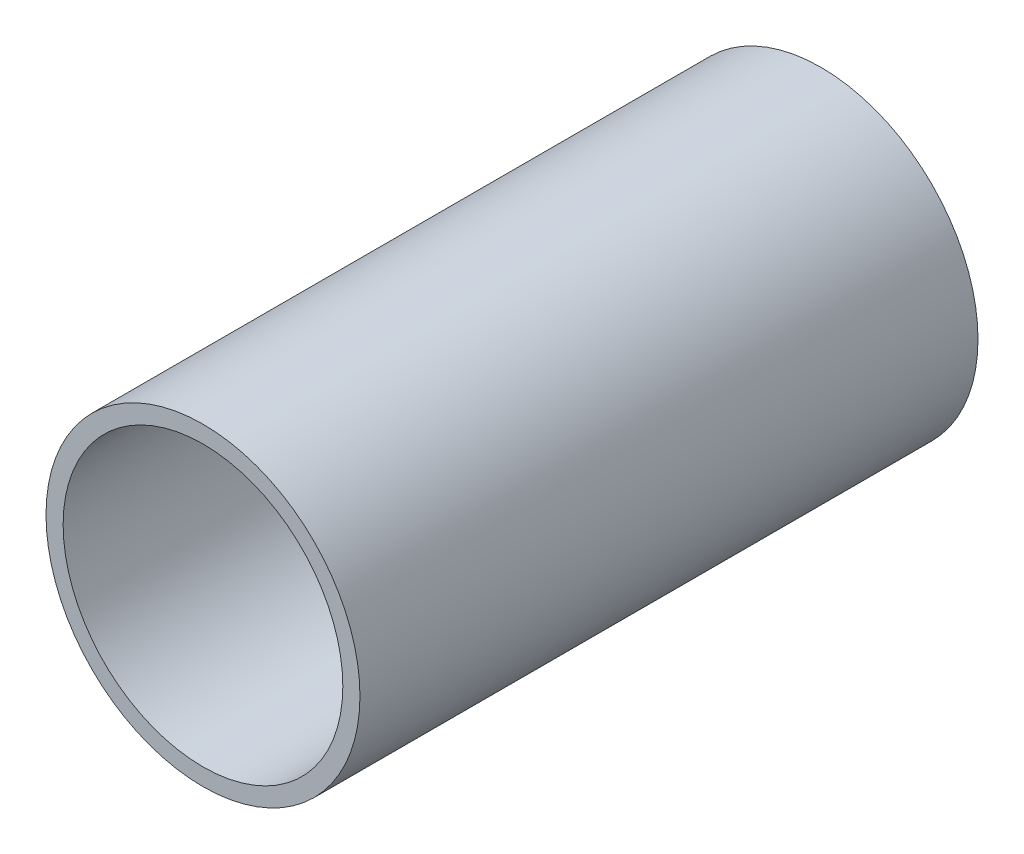
ISO-10303-21;
HEADER;
FILE_DESCRIPTION(('STEP AP214'),'2;1');
FILE_NAME('part.step','',(''),(''),'','','');
FILE_SCHEMA(('AUTOMOTIVE_DESIGN { 1 0 10303 214 1 1 1 1 }'));
ENDSEC;
DATA;
#1=APPLICATION_CONTEXT('core data for automotive mechanical design processes');
#2=APPLICATION_PROTOCOL_DEFINITION('international standard','automotive_design',2000,#1);
#3=PRODUCT_CONTEXT('',#1,'mechanical');
#4=PRODUCT('Part','Part','',(#3));
#5=PRODUCT_RELATED_PRODUCT_CATEGORY('part','',(#4));
#6=PRODUCT_DEFINITION_FORMATION('','',#4);
#7=PRODUCT_DEFINITION_CONTEXT('part definition',#1,'design');
#8=PRODUCT_DEFINITION('design','',#6,#7);
#9=PRODUCT_DEFINITION_SHAPE('','',#8);
#10=(LENGTH_UNIT() NAMED_UNIT(*) SI_UNIT(.MILLI.,.METRE.));
#11=(NAMED_UNIT(*) PLANE_ANGLE_UNIT() SI_UNIT($,.RADIAN.));
#12=(NAMED_UNIT(*) SI_UNIT($,.STERADIAN.) SOLID_ANGLE_UNIT());
#13=UNCERTAINTY_MEASURE_WITH_UNIT(LENGTH_MEASURE(1.E-05),#10,'distance_accuracy_value','');
#14=(GEOMETRIC_REPRESENTATION_CONTEXT(3) GLOBAL_UNCERTAINTY_ASSIGNED_CONTEXT((#13)) GLOBAL_UNIT_ASSIGNED_CONTEXT((#10,
#11,#12)) REPRESENTATION_CONTEXT('',''));
#15=CARTESIAN_POINT('',(0.,0.,0.));
#16=DIRECTION('',(0.,0.,1.));
#17=DIRECTION('',(1.,0.,0.));
#18=AXIS2_PLACEMENT_3D('',#15,#16,#17);
#19=CARTESIAN_POINT('',(0.,38.1,0.));
#20=DIRECTION('',(0.,0.,-1.));
#21=DIRECTION('',(-1.,0.,0.));
#22=AXIS2_PLACEMENT_3D('',#19,#20,#21);
#23=PLANE('',#22);
#24=CARTESIAN_POINT('',(0.,0.,0.));
#25=DIRECTION('',(0.,0.,1.));
#26=DIRECTION('',(1.,0.,0.));
#27=AXIS2_PLACEMENT_3D('',#24,#25,#26);
#28=CIRCLE('',#27,33.94);
#29=CARTESIAN_POINT('',(33.94,0.,0.));
#30=VERTEX_POINT('',#29);
#31=EDGE_CURVE('E10',#30,#30,#28,.T.);
#32=ORIENTED_EDGE('',*,*,#31,.F.);
#33=EDGE_LOOP('',(#32));
#34=FACE_BOUND('',#33,.T.);
#35=CARTESIAN_POINT('',(0.,0.,0.));
#36=DIRECTION('',(0.,0.,1.));
#37=DIRECTION('',(1.,0.,0.));
#38=AXIS2_PLACEMENT_3D('',#35,#36,#37);
#39=CIRCLE('',#38,38.1);
#40=CARTESIAN_POINT('',(38.1,0.,0.));
#41=VERTEX_POINT('',#40);
#42=EDGE_CURVE('E47',#41,#41,#39,.T.);
#43=ORIENTED_EDGE('',*,*,#42,.T.);
#44=EDGE_LOOP('',(#43));
#45=FACE_BOUND('',#44,.T.);
#46=ADVANCED_FACE('F33',(#34,#45),#23,.F.);
#47=CARTESIAN_POINT('',(0.,0.,0.));
#48=DIRECTION('',(0.,0.,1.));
#49=DIRECTION('',(1.,0.,0.));
#50=AXIS2_PLACEMENT_3D('',#47,#48,#49);
#51=CYLINDRICAL_SURFACE('',#50,33.94);
#52=CARTESIAN_POINT('',(0.,0.,-150.));
#53=DIRECTION('',(0.,0.,1.));
#54=DIRECTION('',(1.,0.,0.));
#55=AXIS2_PLACEMENT_3D('',#52,#53,#54);
#56=CIRCLE('',#55,33.94);
#57=CARTESIAN_POINT('',(33.94,0.,-150.));
#58=VERTEX_POINT('',#57);
#59=EDGE_CURVE('E39',#58,#58,#56,.T.);
#60=ORIENTED_EDGE('',*,*,#59,.F.);
#61=EDGE_LOOP('',(#60));
#62=FACE_BOUND('',#61,.T.);
#63=ORIENTED_EDGE('',*,*,#31,.T.);
#64=EDGE_LOOP('',(#63));
#65=FACE_BOUND('',#64,.T.);
#66=ADVANCED_FACE('F62',(#62,#65),#51,.F.);
#67=CARTESIAN_POINT('',(0.,33.94,-150.));
#68=DIRECTION('',(0.,0.,1.));
#69=DIRECTION('',(1.,0.,0.));
#70=AXIS2_PLACEMENT_3D('',#67,#68,#69);
#71=PLANE('',#70);
#72=CARTESIAN_POINT('',(0.,0.,-150.));
#73=DIRECTION('',(0.,0.,1.));
#74=DIRECTION('',(1.,0.,0.));
#75=AXIS2_PLACEMENT_3D('',#72,#73,#74);
#76=CIRCLE('',#75,38.1);
#77=CARTESIAN_POINT('',(38.1,0.,-150.));
#78=VERTEX_POINT('',#77);
#79=EDGE_CURVE('E43',#78,#78,#76,.T.);
#80=ORIENTED_EDGE('',*,*,#79,.F.);
#81=EDGE_LOOP('',(#80));
#82=FACE_BOUND('',#81,.T.);
#83=ORIENTED_EDGE('',*,*,#59,.T.);
#84=EDGE_LOOP('',(#83));
#85=FACE_BOUND('',#84,.T.);
#86=ADVANCED_FACE('F57',(#82,#85),#71,.F.);
#87=CARTESIAN_POINT('',(0.,0.,0.));
#88=DIRECTION('',(0.,0.,1.));
#89=DIRECTION('',(1.,0.,0.));
#90=AXIS2_PLACEMENT_3D('',#87,#88,#89);
#91=CYLINDRICAL_SURFACE('',#90,38.1);
#92=ORIENTED_EDGE('',*,*,#42,.F.);
#93=EDGE_LOOP('',(#92));
#94=FACE_BOUND('',#93,.T.);
#95=ORIENTED_EDGE('',*,*,#79,.T.);
#96=EDGE_LOOP('',(#95));
#97=FACE_BOUND('',#96,.T.);
#98=ADVANCED_FACE('F54',(#94,#97),#91,.T.);
#99=CLOSED_SHELL('',(#46,#66,#86,#98));
#100=MANIFOLD_SOLID_BREP('B2',#99);
#101=ADVANCED_BREP_SHAPE_REPRESENTATION('',(#18,#100),#14);
#102=SHAPE_DEFINITION_REPRESENTATION(#9,#101);
ENDSEC;
END-ISO-10303-21;
